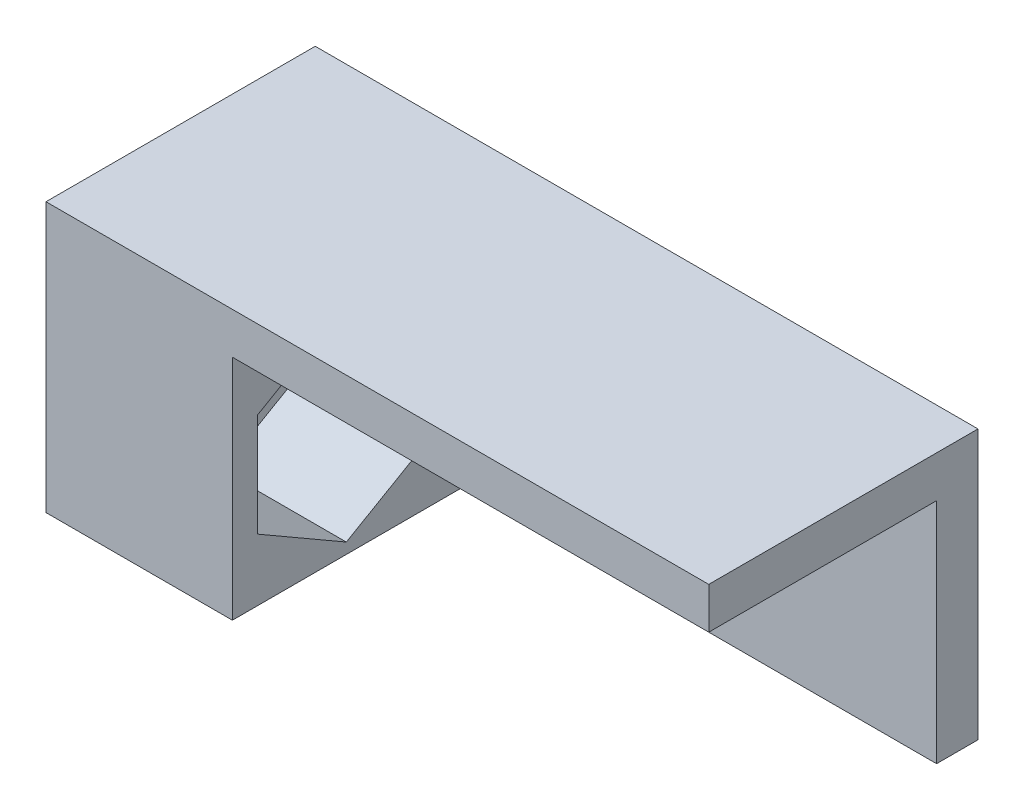
ISO-10303-21;
HEADER;
FILE_DESCRIPTION(('STEP AP214'),'2;1');
FILE_NAME('part.step','',(''),(''),'','','');
FILE_SCHEMA(('AUTOMOTIVE_DESIGN { 1 0 10303 214 1 1 1 1 }'));
ENDSEC;
DATA;
#1=APPLICATION_CONTEXT('core data for automotive mechanical design processes');
#2=APPLICATION_PROTOCOL_DEFINITION('international standard','automotive_design',2000,#1);
#3=PRODUCT_CONTEXT('',#1,'mechanical');
#4=PRODUCT('Part','Part','',(#3));
#5=PRODUCT_RELATED_PRODUCT_CATEGORY('part','',(#4));
#6=PRODUCT_DEFINITION_FORMATION('','',#4);
#7=PRODUCT_DEFINITION_CONTEXT('part definition',#1,'design');
#8=PRODUCT_DEFINITION('design','',#6,#7);
#9=PRODUCT_DEFINITION_SHAPE('','',#8);
#10=(LENGTH_UNIT() NAMED_UNIT(*) SI_UNIT(.MILLI.,.METRE.));
#11=(NAMED_UNIT(*) PLANE_ANGLE_UNIT() SI_UNIT($,.RADIAN.));
#12=(NAMED_UNIT(*) SI_UNIT($,.STERADIAN.) SOLID_ANGLE_UNIT());
#13=UNCERTAINTY_MEASURE_WITH_UNIT(LENGTH_MEASURE(1.E-05),#10,'distance_accuracy_value','');
#14=(GEOMETRIC_REPRESENTATION_CONTEXT(3) GLOBAL_UNCERTAINTY_ASSIGNED_CONTEXT((#13)) GLOBAL_UNIT_ASSIGNED_CONTEXT((#10,
#11,#12)) REPRESENTATION_CONTEXT('',''));
#15=CARTESIAN_POINT('',(0.,0.,0.));
#16=DIRECTION('',(0.,0.,1.));
#17=DIRECTION('',(1.,0.,0.));
#18=AXIS2_PLACEMENT_3D('',#15,#16,#17);
#19=CARTESIAN_POINT('',(0.,0.,0.));
#20=DIRECTION('',(0.,1.,0.));
#21=DIRECTION('',(0.,0.,1.));
#22=AXIS2_PLACEMENT_3D('',#19,#20,#21);
#23=PLANE('',#22);
#24=DIRECTION('',(0.,0.,1.));
#25=VECTOR('',#24,1.);
#26=CARTESIAN_POINT('',(-4.51290684624018,0.,1.44556677890011));
#27=LINE('',#26,#25);
#28=CARTESIAN_POINT('',(-4.51290684624018,0.,-9.55443322109989));
#29=VERTEX_POINT('',#28);
#30=CARTESIAN_POINT('',(-4.51290684624018,0.,1.44556677890011));
#31=VERTEX_POINT('',#30);
#32=EDGE_CURVE('E206',#29,#31,#27,.T.);
#33=ORIENTED_EDGE('',*,*,#32,.F.);
#34=DIRECTION('',(-1.,0.,0.));
#35=VECTOR('',#34,1.);
#36=CARTESIAN_POINT('',(-13.5129068462402,0.,-9.55443322109989));
#37=LINE('',#36,#35);
#38=CARTESIAN_POINT('',(18.4870931537598,0.,-9.55443322109989));
#39=VERTEX_POINT('',#38);
#40=EDGE_CURVE('E234',#39,#29,#37,.T.);
#41=ORIENTED_EDGE('',*,*,#40,.F.);
#42=DIRECTION('',(0.,0.,-1.));
#43=VECTOR('',#42,1.);
#44=CARTESIAN_POINT('',(18.4870931537598,0.,-11.5544332210999));
#45=LINE('',#44,#43);
#46=CARTESIAN_POINT('',(18.4870931537598,0.,1.44556677890011));
#47=VERTEX_POINT('',#46);
#48=EDGE_CURVE('E265',#47,#39,#45,.T.);
#49=ORIENTED_EDGE('',*,*,#48,.F.);
#50=DIRECTION('',(1.,0.,0.));
#51=VECTOR('',#50,1.);
#52=CARTESIAN_POINT('',(-13.5129068462402,0.,1.44556677890011));
#53=LINE('',#52,#51);
#54=EDGE_CURVE('E67',#31,#47,#53,.T.);
#55=ORIENTED_EDGE('',*,*,#54,.F.);
#56=EDGE_LOOP('',(#33,#41,#49,#55));
#57=FACE_BOUND('',#56,.T.);
#58=ADVANCED_FACE('F44',(#57),#23,.F.);
#59=CARTESIAN_POINT('',(-13.5129068462402,-11.,-9.55443322109989));
#60=DIRECTION('',(0.,0.,-1.));
#61=DIRECTION('',(-1.,0.,0.));
#62=AXIS2_PLACEMENT_3D('',#59,#60,#61);
#63=PLANE('',#62);
#64=DIRECTION('',(0.,1.,0.));
#65=VECTOR('',#64,1.);
#66=CARTESIAN_POINT('',(-4.51290684624018,-11.,-9.55443322109989));
#67=LINE('',#66,#65);
#68=CARTESIAN_POINT('',(-4.51290684624018,-11.,-9.55443322109989));
#69=VERTEX_POINT('',#68);
#70=EDGE_CURVE('E231',#69,#29,#67,.T.);
#71=ORIENTED_EDGE('',*,*,#70,.F.);
#72=DIRECTION('',(-1.,0.,0.));
#73=VECTOR('',#72,1.);
#74=CARTESIAN_POINT('',(-13.5129068462402,-11.,-9.55443322109989));
#75=LINE('',#74,#73);
#76=CARTESIAN_POINT('',(18.4870931537598,-11.,-9.55443322109988));
#77=VERTEX_POINT('',#76);
#78=EDGE_CURVE('E250',#77,#69,#75,.T.);
#79=ORIENTED_EDGE('',*,*,#78,.F.);
#80=DIRECTION('',(0.,1.,0.));
#81=VECTOR('',#80,1.);
#82=CARTESIAN_POINT('',(18.4870931537598,-11.,-9.55443322109988));
#83=LINE('',#82,#81);
#84=EDGE_CURVE('E253',#77,#39,#83,.T.);
#85=ORIENTED_EDGE('',*,*,#84,.T.);
#86=ORIENTED_EDGE('',*,*,#40,.T.);
#87=EDGE_LOOP('',(#71,#79,#85,#86));
#88=FACE_BOUND('',#87,.T.);
#89=ADVANCED_FACE('F292',(#88),#63,.F.);
#90=CARTESIAN_POINT('',(-13.5129068462402,2.,-11.5544332210999));
#91=DIRECTION('',(1.,0.,0.));
#92=DIRECTION('',(0.,0.,-1.));
#93=AXIS2_PLACEMENT_3D('',#90,#91,#92);
#94=PLANE('',#93);
#95=CARTESIAN_POINT('',(-13.5129068462402,-5.51521231503078,-4.05443322109989));
#96=DIRECTION('',(1.,0.,0.));
#97=DIRECTION('',(0.,0.,-1.));
#98=AXIS2_PLACEMENT_3D('',#95,#96,#97);
#99=CIRCLE('',#98,2.1);
#100=CARTESIAN_POINT('',(-13.5129068462402,-5.51521231503078,-6.15443322109989));
#101=VERTEX_POINT('',#100);
#102=EDGE_CURVE('E187',#101,#101,#99,.T.);
#103=ORIENTED_EDGE('',*,*,#102,.T.);
#104=EDGE_LOOP('',(#103));
#105=FACE_BOUND('',#104,.T.);
#106=DIRECTION('',(0.,0.,-1.));
#107=VECTOR('',#106,1.);
#108=CARTESIAN_POINT('',(-13.5129068462402,-11.,-11.5544332210999));
#109=LINE('',#108,#107);
#110=CARTESIAN_POINT('',(-13.5129068462402,-11.,1.44556677890011));
#111=VERTEX_POINT('',#110);
#112=CARTESIAN_POINT('',(-13.5129068462402,-11.,-11.5544332210999));
#113=VERTEX_POINT('',#112);
#114=EDGE_CURVE('E237',#111,#113,#109,.T.);
#115=ORIENTED_EDGE('',*,*,#114,.F.);
#116=DIRECTION('',(0.,-1.,0.));
#117=VECTOR('',#116,1.);
#118=CARTESIAN_POINT('',(-13.5129068462402,2.,1.44556677890011));
#119=LINE('',#118,#117);
#120=CARTESIAN_POINT('',(-13.5129068462402,2.,1.44556677890011));
#121=VERTEX_POINT('',#120);
#122=EDGE_CURVE('E11',#121,#111,#119,.T.);
#123=ORIENTED_EDGE('',*,*,#122,.F.);
#124=DIRECTION('',(0.,0.,1.));
#125=VECTOR('',#124,1.);
#126=CARTESIAN_POINT('',(-13.5129068462402,2.,-11.5544332210999));
#127=LINE('',#126,#125);
#128=CARTESIAN_POINT('',(-13.5129068462402,2.,-11.5544332210999));
#129=VERTEX_POINT('',#128);
#130=EDGE_CURVE('E260',#129,#121,#127,.T.);
#131=ORIENTED_EDGE('',*,*,#130,.F.);
#132=DIRECTION('',(0.,-1.,0.));
#133=VECTOR('',#132,1.);
#134=CARTESIAN_POINT('',(-13.5129068462402,2.,-11.5544332210999));
#135=LINE('',#134,#133);
#136=EDGE_CURVE('E271',#129,#113,#135,.T.);
#137=ORIENTED_EDGE('',*,*,#136,.T.);
#138=EDGE_LOOP('',(#115,#123,#131,#137));
#139=FACE_BOUND('',#138,.T.);
#140=ADVANCED_FACE('F50',(#105,#139),#94,.F.);
#141=CARTESIAN_POINT('',(-13.5129068462402,2.,1.44556677890011));
#142=DIRECTION('',(0.,0.,-1.));
#143=DIRECTION('',(-1.,0.,0.));
#144=AXIS2_PLACEMENT_3D('',#141,#142,#143);
#145=PLANE('',#144);
#146=ORIENTED_EDGE('',*,*,#122,.T.);
#147=DIRECTION('',(-1.,0.,0.));
#148=VECTOR('',#147,1.);
#149=CARTESIAN_POINT('',(-13.5129068462402,-11.,1.44556677890011));
#150=LINE('',#149,#148);
#151=CARTESIAN_POINT('',(-4.51290684624018,-11.,1.44556677890011));
#152=VERTEX_POINT('',#151);
#153=EDGE_CURVE('E222',#152,#111,#150,.T.);
#154=ORIENTED_EDGE('',*,*,#153,.F.);
#155=DIRECTION('',(0.,1.,0.));
#156=VECTOR('',#155,1.);
#157=CARTESIAN_POINT('',(-4.51290684624018,-11.,1.44556677890011));
#158=LINE('',#157,#156);
#159=EDGE_CURVE('E223',#152,#31,#158,.T.);
#160=ORIENTED_EDGE('',*,*,#159,.T.);
#161=ORIENTED_EDGE('',*,*,#54,.T.);
#162=DIRECTION('',(0.,-1.,0.));
#163=VECTOR('',#162,1.);
#164=CARTESIAN_POINT('',(18.4870931537598,2.,1.44556677890011));
#165=LINE('',#164,#163);
#166=CARTESIAN_POINT('',(18.4870931537598,2.,1.44556677890011));
#167=VERTEX_POINT('',#166);
#168=EDGE_CURVE('E53',#167,#47,#165,.T.);
#169=ORIENTED_EDGE('',*,*,#168,.F.);
#170=DIRECTION('',(1.,0.,0.));
#171=VECTOR('',#170,1.);
#172=CARTESIAN_POINT('',(-13.5129068462402,2.,1.44556677890011));
#173=LINE('',#172,#171);
#174=EDGE_CURVE('E261',#121,#167,#173,.T.);
#175=ORIENTED_EDGE('',*,*,#174,.F.);
#176=EDGE_LOOP('',(#146,#154,#160,#161,#169,#175));
#177=FACE_BOUND('',#176,.T.);
#178=ADVANCED_FACE('F307',(#177),#145,.F.);
#179=CARTESIAN_POINT('',(18.4870931537598,2.,-11.5544332210999));
#180=DIRECTION('',(-1.,0.,0.));
#181=DIRECTION('',(0.,0.,1.));
#182=AXIS2_PLACEMENT_3D('',#179,#180,#181);
#183=PLANE('',#182);
#184=ORIENTED_EDGE('',*,*,#48,.T.);
#185=ORIENTED_EDGE('',*,*,#84,.F.);
#186=DIRECTION('',(0.,0.,1.));
#187=VECTOR('',#186,1.);
#188=CARTESIAN_POINT('',(18.4870931537598,-11.,-11.5544332210999));
#189=LINE('',#188,#187);
#190=CARTESIAN_POINT('',(18.4870931537598,-11.,-11.5544332210999));
#191=VERTEX_POINT('',#190);
#192=EDGE_CURVE('E242',#191,#77,#189,.T.);
#193=ORIENTED_EDGE('',*,*,#192,.F.);
#194=DIRECTION('',(0.,-1.,0.));
#195=VECTOR('',#194,1.);
#196=CARTESIAN_POINT('',(18.4870931537598,2.,-11.5544332210999));
#197=LINE('',#196,#195);
#198=CARTESIAN_POINT('',(18.4870931537598,2.,-11.5544332210999));
#199=VERTEX_POINT('',#198);
#200=EDGE_CURVE('E276',#199,#191,#197,.T.);
#201=ORIENTED_EDGE('',*,*,#200,.F.);
#202=DIRECTION('',(0.,0.,-1.));
#203=VECTOR('',#202,1.);
#204=CARTESIAN_POINT('',(18.4870931537598,2.,-11.5544332210999));
#205=LINE('',#204,#203);
#206=EDGE_CURVE('E264',#167,#199,#205,.T.);
#207=ORIENTED_EDGE('',*,*,#206,.F.);
#208=ORIENTED_EDGE('',*,*,#168,.T.);
#209=EDGE_LOOP('',(#184,#185,#193,#201,#207,#208));
#210=FACE_BOUND('',#209,.T.);
#211=ADVANCED_FACE('F286',(#210),#183,.F.);
#212=CARTESIAN_POINT('',(-13.5129068462402,2.,-11.5544332210999));
#213=DIRECTION('',(0.,0.,1.));
#214=DIRECTION('',(1.,0.,0.));
#215=AXIS2_PLACEMENT_3D('',#212,#213,#214);
#216=PLANE('',#215);
#217=ORIENTED_EDGE('',*,*,#200,.T.);
#218=DIRECTION('',(1.,0.,0.));
#219=VECTOR('',#218,1.);
#220=CARTESIAN_POINT('',(-13.5129068462402,-11.,-11.5544332210999));
#221=LINE('',#220,#219);
#222=EDGE_CURVE('E238',#113,#191,#221,.T.);
#223=ORIENTED_EDGE('',*,*,#222,.F.);
#224=ORIENTED_EDGE('',*,*,#136,.F.);
#225=DIRECTION('',(-1.,0.,0.));
#226=VECTOR('',#225,1.);
#227=CARTESIAN_POINT('',(-13.5129068462402,2.,-11.5544332210999));
#228=LINE('',#227,#226);
#229=EDGE_CURVE('E268',#199,#129,#228,.T.);
#230=ORIENTED_EDGE('',*,*,#229,.F.);
#231=EDGE_LOOP('',(#217,#223,#224,#230));
#232=FACE_BOUND('',#231,.T.);
#233=ADVANCED_FACE('F305',(#232),#216,.F.);
#234=CARTESIAN_POINT('',(0.,2.,0.));
#235=DIRECTION('',(0.,1.,0.));
#236=DIRECTION('',(0.,0.,1.));
#237=AXIS2_PLACEMENT_3D('',#234,#235,#236);
#238=PLANE('',#237);
#239=ORIENTED_EDGE('',*,*,#130,.T.);
#240=ORIENTED_EDGE('',*,*,#174,.T.);
#241=ORIENTED_EDGE('',*,*,#206,.T.);
#242=ORIENTED_EDGE('',*,*,#229,.T.);
#243=EDGE_LOOP('',(#239,#240,#241,#242));
#244=FACE_BOUND('',#243,.T.);
#245=ADVANCED_FACE('F304',(#244),#238,.T.);
#246=CARTESIAN_POINT('',(0.,-11.,0.));
#247=DIRECTION('',(0.,1.,0.));
#248=DIRECTION('',(0.,0.,1.));
#249=AXIS2_PLACEMENT_3D('',#246,#247,#248);
#250=PLANE('',#249);
#251=ORIENTED_EDGE('',*,*,#114,.T.);
#252=ORIENTED_EDGE('',*,*,#222,.T.);
#253=ORIENTED_EDGE('',*,*,#192,.T.);
#254=ORIENTED_EDGE('',*,*,#78,.T.);
#255=DIRECTION('',(0.,0.,1.));
#256=VECTOR('',#255,1.);
#257=CARTESIAN_POINT('',(-4.51290684624018,-11.,1.44556677890011));
#258=LINE('',#257,#256);
#259=EDGE_CURVE('E217',#69,#152,#258,.T.);
#260=ORIENTED_EDGE('',*,*,#259,.T.);
#261=ORIENTED_EDGE('',*,*,#153,.T.);
#262=EDGE_LOOP('',(#251,#252,#253,#254,#260,#261));
#263=FACE_BOUND('',#262,.T.);
#264=ADVANCED_FACE('F298',(#263),#250,.F.);
#265=CARTESIAN_POINT('',(-4.51290684624018,-11.,1.44556677890011));
#266=DIRECTION('',(-1.,0.,0.));
#267=DIRECTION('',(0.,0.,1.));
#268=AXIS2_PLACEMENT_3D('',#265,#266,#267);
#269=PLANE('',#268);
#270=DIRECTION('',(0.,0.5,-0.866025403784438));
#271=VECTOR('',#270,1.);
#272=CARTESIAN_POINT('',(-4.51290684624018,-10.4804246300616,-4.05443322109989));
#273=LINE('',#272,#271);
#274=CARTESIAN_POINT('',(-4.51290684624018,-10.4804246300616,-4.05443322109989));
#275=VERTEX_POINT('',#274);
#276=CARTESIAN_POINT('',(-4.51290684624018,-7.99781847254617,-8.35443322109989));
#277=VERTEX_POINT('',#276);
#278=EDGE_CURVE('E186',#275,#277,#273,.T.);
#279=ORIENTED_EDGE('',*,*,#278,.F.);
#280=DIRECTION('',(0.,-0.5,-0.866025403784439));
#281=VECTOR('',#280,1.);
#282=CARTESIAN_POINT('',(-4.51290684624018,-7.99781847254618,0.245566778900115));
#283=LINE('',#282,#281);
#284=CARTESIAN_POINT('',(-4.51290684624018,-7.99781847254618,0.245566778900115));
#285=VERTEX_POINT('',#284);
#286=EDGE_CURVE('E63',#285,#275,#283,.T.);
#287=ORIENTED_EDGE('',*,*,#286,.F.);
#288=DIRECTION('',(0.,-1.,0.));
#289=VECTOR('',#288,1.);
#290=CARTESIAN_POINT('',(-4.51290684624018,-3.03260615751539,0.245566778900115));
#291=LINE('',#290,#289);
#292=CARTESIAN_POINT('',(-4.51290684624018,-3.03260615751539,0.245566778900115));
#293=VERTEX_POINT('',#292);
#294=EDGE_CURVE('E164',#293,#285,#291,.T.);
#295=ORIENTED_EDGE('',*,*,#294,.F.);
#296=DIRECTION('',(0.,-0.5,0.866025403784438));
#297=VECTOR('',#296,1.);
#298=CARTESIAN_POINT('',(-4.51290684624018,-0.549999999999999,-4.05443322109989));
#299=LINE('',#298,#297);
#300=CARTESIAN_POINT('',(-4.51290684624018,-0.549999999999999,-4.05443322109989));
#301=VERTEX_POINT('',#300);
#302=EDGE_CURVE('E166',#301,#293,#299,.T.);
#303=ORIENTED_EDGE('',*,*,#302,.F.);
#304=DIRECTION('',(0.,0.5,0.866025403784439));
#305=VECTOR('',#304,1.);
#306=CARTESIAN_POINT('',(-4.51290684624018,-3.03260615751539,-8.35443322109989));
#307=LINE('',#306,#305);
#308=CARTESIAN_POINT('',(-4.51290684624018,-3.03260615751539,-8.35443322109989));
#309=VERTEX_POINT('',#308);
#310=EDGE_CURVE('E198',#309,#301,#307,.T.);
#311=ORIENTED_EDGE('',*,*,#310,.F.);
#312=DIRECTION('',(0.,1.,0.));
#313=VECTOR('',#312,1.);
#314=CARTESIAN_POINT('',(-4.51290684624018,-7.99781847254617,-8.35443322109989));
#315=LINE('',#314,#313);
#316=EDGE_CURVE('E195',#277,#309,#315,.T.);
#317=ORIENTED_EDGE('',*,*,#316,.F.);
#318=EDGE_LOOP('',(#279,#287,#295,#303,#311,#317));
#319=FACE_BOUND('',#318,.T.);
#320=ORIENTED_EDGE('',*,*,#32,.T.);
#321=ORIENTED_EDGE('',*,*,#159,.F.);
#322=ORIENTED_EDGE('',*,*,#259,.F.);
#323=ORIENTED_EDGE('',*,*,#70,.T.);
#324=EDGE_LOOP('',(#320,#321,#322,#323));
#325=FACE_BOUND('',#324,.T.);
#326=ADVANCED_FACE('F315',(#319,#325),#269,.F.);
#327=CARTESIAN_POINT('',(-10.5129068462402,-7.99781847254618,0.245566778900114));
#328=DIRECTION('',(0.,-0.866025403784439,0.5));
#329=DIRECTION('',(0.,-0.5,-0.866025403784439));
#330=AXIS2_PLACEMENT_3D('',#327,#328,#329);
#331=PLANE('',#330);
#332=ORIENTED_EDGE('',*,*,#286,.T.);
#333=DIRECTION('',(1.,0.,0.));
#334=VECTOR('',#333,1.);
#335=CARTESIAN_POINT('',(-10.5129068462402,-10.4804246300616,-4.05443322109989));
#336=LINE('',#335,#334);
#337=CARTESIAN_POINT('',(-10.5129068462402,-10.4804246300616,-4.05443322109989));
#338=VERTEX_POINT('',#337);
#339=EDGE_CURVE('E137',#338,#275,#336,.T.);
#340=ORIENTED_EDGE('',*,*,#339,.F.);
#341=DIRECTION('',(0.,-0.5,-0.866025403784439));
#342=VECTOR('',#341,1.);
#343=CARTESIAN_POINT('',(-10.5129068462402,-7.99781847254618,0.245566778900114));
#344=LINE('',#343,#342);
#345=CARTESIAN_POINT('',(-10.5129068462402,-7.99781847254618,0.245566778900114));
#346=VERTEX_POINT('',#345);
#347=EDGE_CURVE('E141',#346,#338,#344,.T.);
#348=ORIENTED_EDGE('',*,*,#347,.F.);
#349=DIRECTION('',(1.,0.,0.));
#350=VECTOR('',#349,1.);
#351=CARTESIAN_POINT('',(-10.5129068462402,-7.99781847254618,0.245566778900114));
#352=LINE('',#351,#350);
#353=EDGE_CURVE('E201',#346,#285,#352,.T.);
#354=ORIENTED_EDGE('',*,*,#353,.T.);
#355=EDGE_LOOP('',(#332,#340,#348,#354));
#356=FACE_BOUND('',#355,.T.);
#357=ADVANCED_FACE('F143',(#356),#331,.F.);
#358=CARTESIAN_POINT('',(-10.5129068462402,-3.03260615751539,0.245566778900114));
#359=DIRECTION('',(0.,0.,1.));
#360=DIRECTION('',(1.,0.,0.));
#361=AXIS2_PLACEMENT_3D('',#358,#359,#360);
#362=PLANE('',#361);
#363=ORIENTED_EDGE('',*,*,#294,.T.);
#364=ORIENTED_EDGE('',*,*,#353,.F.);
#365=DIRECTION('',(0.,-1.,0.));
#366=VECTOR('',#365,1.);
#367=CARTESIAN_POINT('',(-10.5129068462402,-3.03260615751539,0.245566778900114));
#368=LINE('',#367,#366);
#369=CARTESIAN_POINT('',(-10.5129068462402,-3.03260615751539,0.245566778900114));
#370=VERTEX_POINT('',#369);
#371=EDGE_CURVE('E147',#370,#346,#368,.T.);
#372=ORIENTED_EDGE('',*,*,#371,.F.);
#373=DIRECTION('',(1.,0.,0.));
#374=VECTOR('',#373,1.);
#375=CARTESIAN_POINT('',(-10.5129068462402,-3.03260615751539,0.245566778900114));
#376=LINE('',#375,#374);
#377=EDGE_CURVE('E210',#370,#293,#376,.T.);
#378=ORIENTED_EDGE('',*,*,#377,.T.);
#379=EDGE_LOOP('',(#363,#364,#372,#378));
#380=FACE_BOUND('',#379,.T.);
#381=ADVANCED_FACE('F319',(#380),#362,.F.);
#382=CARTESIAN_POINT('',(-10.5129068462402,-0.549999999999999,-4.05443322109989));
#383=DIRECTION('',(0.,0.866025403784439,0.5));
#384=DIRECTION('',(0.,-0.5,0.866025403784439));
#385=AXIS2_PLACEMENT_3D('',#382,#383,#384);
#386=PLANE('',#385);
#387=ORIENTED_EDGE('',*,*,#302,.T.);
#388=ORIENTED_EDGE('',*,*,#377,.F.);
#389=DIRECTION('',(0.,-0.5,0.866025403784438));
#390=VECTOR('',#389,1.);
#391=CARTESIAN_POINT('',(-10.5129068462402,-0.549999999999999,-4.05443322109989));
#392=LINE('',#391,#390);
#393=CARTESIAN_POINT('',(-10.5129068462402,-0.549999999999999,-4.05443322109989));
#394=VERTEX_POINT('',#393);
#395=EDGE_CURVE('E182',#394,#370,#392,.T.);
#396=ORIENTED_EDGE('',*,*,#395,.F.);
#397=DIRECTION('',(1.,0.,0.));
#398=VECTOR('',#397,1.);
#399=CARTESIAN_POINT('',(-10.5129068462402,-0.549999999999999,-4.05443322109989));
#400=LINE('',#399,#398);
#401=EDGE_CURVE('E209',#394,#301,#400,.T.);
#402=ORIENTED_EDGE('',*,*,#401,.T.);
#403=EDGE_LOOP('',(#387,#388,#396,#402));
#404=FACE_BOUND('',#403,.T.);
#405=ADVANCED_FACE('F361',(#404),#386,.F.);
#406=CARTESIAN_POINT('',(-10.5129068462402,-3.03260615751539,-8.35443322109989));
#407=DIRECTION('',(0.,0.866025403784438,-0.5));
#408=DIRECTION('',(0.,0.5,0.866025403784439));
#409=AXIS2_PLACEMENT_3D('',#406,#407,#408);
#410=PLANE('',#409);
#411=ORIENTED_EDGE('',*,*,#310,.T.);
#412=ORIENTED_EDGE('',*,*,#401,.F.);
#413=DIRECTION('',(0.,0.5,0.866025403784439));
#414=VECTOR('',#413,1.);
#415=CARTESIAN_POINT('',(-10.5129068462402,-3.03260615751539,-8.35443322109989));
#416=LINE('',#415,#414);
#417=CARTESIAN_POINT('',(-10.5129068462402,-3.03260615751539,-8.35443322109989));
#418=VERTEX_POINT('',#417);
#419=EDGE_CURVE('E180',#418,#394,#416,.T.);
#420=ORIENTED_EDGE('',*,*,#419,.F.);
#421=DIRECTION('',(1.,0.,0.));
#422=VECTOR('',#421,1.);
#423=CARTESIAN_POINT('',(-10.5129068462402,-3.03260615751539,-8.35443322109989));
#424=LINE('',#423,#422);
#425=EDGE_CURVE('E213',#418,#309,#424,.T.);
#426=ORIENTED_EDGE('',*,*,#425,.T.);
#427=EDGE_LOOP('',(#411,#412,#420,#426));
#428=FACE_BOUND('',#427,.T.);
#429=ADVANCED_FACE('F370',(#428),#410,.F.);
#430=CARTESIAN_POINT('',(-10.5129068462402,-7.99781847254617,-8.35443322109989));
#431=DIRECTION('',(0.,0.,-1.));
#432=DIRECTION('',(0.,1.,0.));
#433=AXIS2_PLACEMENT_3D('',#430,#431,#432);
#434=PLANE('',#433);
#435=ORIENTED_EDGE('',*,*,#316,.T.);
#436=ORIENTED_EDGE('',*,*,#425,.F.);
#437=DIRECTION('',(0.,1.,0.));
#438=VECTOR('',#437,1.);
#439=CARTESIAN_POINT('',(-10.5129068462402,-7.99781847254617,-8.35443322109989));
#440=LINE('',#439,#438);
#441=CARTESIAN_POINT('',(-10.5129068462402,-7.99781847254617,-8.35443322109989));
#442=VERTEX_POINT('',#441);
#443=EDGE_CURVE('E157',#442,#418,#440,.T.);
#444=ORIENTED_EDGE('',*,*,#443,.F.);
#445=DIRECTION('',(1.,0.,0.));
#446=VECTOR('',#445,1.);
#447=CARTESIAN_POINT('',(-10.5129068462402,-7.99781847254617,-8.35443322109989));
#448=LINE('',#447,#446);
#449=EDGE_CURVE('E149',#442,#277,#448,.T.);
#450=ORIENTED_EDGE('',*,*,#449,.T.);
#451=EDGE_LOOP('',(#435,#436,#444,#450));
#452=FACE_BOUND('',#451,.T.);
#453=ADVANCED_FACE('F358',(#452),#434,.F.);
#454=CARTESIAN_POINT('',(-10.5129068462402,-10.4804246300616,-4.05443322109989));
#455=DIRECTION('',(0.,-0.866025403784438,-0.5));
#456=DIRECTION('',(0.,0.5,-0.866025403784439));
#457=AXIS2_PLACEMENT_3D('',#454,#455,#456);
#458=PLANE('',#457);
#459=ORIENTED_EDGE('',*,*,#278,.T.);
#460=ORIENTED_EDGE('',*,*,#449,.F.);
#461=DIRECTION('',(0.,0.5,-0.866025403784438));
#462=VECTOR('',#461,1.);
#463=CARTESIAN_POINT('',(-10.5129068462402,-10.4804246300616,-4.05443322109989));
#464=LINE('',#463,#462);
#465=EDGE_CURVE('E153',#338,#442,#464,.T.);
#466=ORIENTED_EDGE('',*,*,#465,.F.);
#467=ORIENTED_EDGE('',*,*,#339,.T.);
#468=EDGE_LOOP('',(#459,#460,#466,#467));
#469=FACE_BOUND('',#468,.T.);
#470=ADVANCED_FACE('F152',(#469),#458,.F.);
#471=CARTESIAN_POINT('',(-10.5129068462402,0.,0.));
#472=DIRECTION('',(1.,0.,0.));
#473=DIRECTION('',(0.,0.,-1.));
#474=AXIS2_PLACEMENT_3D('',#471,#472,#473);
#475=PLANE('',#474);
#476=CARTESIAN_POINT('',(-10.5129068462402,-5.51521231503078,-4.05443322109989));
#477=DIRECTION('',(1.,0.,0.));
#478=DIRECTION('',(0.,0.,-1.));
#479=AXIS2_PLACEMENT_3D('',#476,#477,#478);
#480=CIRCLE('',#479,2.1);
#481=CARTESIAN_POINT('',(-10.5129068462402,-5.51521231503078,-6.15443322109989));
#482=VERTEX_POINT('',#481);
#483=EDGE_CURVE('E175',#482,#482,#480,.T.);
#484=ORIENTED_EDGE('',*,*,#483,.F.);
#485=EDGE_LOOP('',(#484));
#486=FACE_BOUND('',#485,.T.);
#487=ORIENTED_EDGE('',*,*,#347,.T.);
#488=ORIENTED_EDGE('',*,*,#465,.T.);
#489=ORIENTED_EDGE('',*,*,#443,.T.);
#490=ORIENTED_EDGE('',*,*,#419,.T.);
#491=ORIENTED_EDGE('',*,*,#395,.T.);
#492=ORIENTED_EDGE('',*,*,#371,.T.);
#493=EDGE_LOOP('',(#487,#488,#489,#490,#491,#492));
#494=FACE_BOUND('',#493,.T.);
#495=ADVANCED_FACE('F161',(#486,#494),#475,.T.);
#496=CARTESIAN_POINT('',(-13.5129068462402,-5.51521231503078,-4.05443322109989));
#497=DIRECTION('',(1.,0.,0.));
#498=DIRECTION('',(0.,0.,-1.));
#499=AXIS2_PLACEMENT_3D('',#496,#497,#498);
#500=CYLINDRICAL_SURFACE('',#499,2.1);
#501=ORIENTED_EDGE('',*,*,#102,.F.);
#502=EDGE_LOOP('',(#501));
#503=FACE_BOUND('',#502,.T.);
#504=ORIENTED_EDGE('',*,*,#483,.T.);
#505=EDGE_LOOP('',(#504));
#506=FACE_BOUND('',#505,.T.);
#507=ADVANCED_FACE('F353',(#503,#506),#500,.F.);
#508=CLOSED_SHELL('',(#58,#89,#140,#178,#211,#233,#245,#264,#326,#357,#381,#405,#429,#453,#470,
#495,#507));
#509=MANIFOLD_SOLID_BREP('B2',#508);
#510=ADVANCED_BREP_SHAPE_REPRESENTATION('',(#18,#509),#14);
#511=SHAPE_DEFINITION_REPRESENTATION(#9,#510);
ENDSEC;
END-ISO-10303-21;
